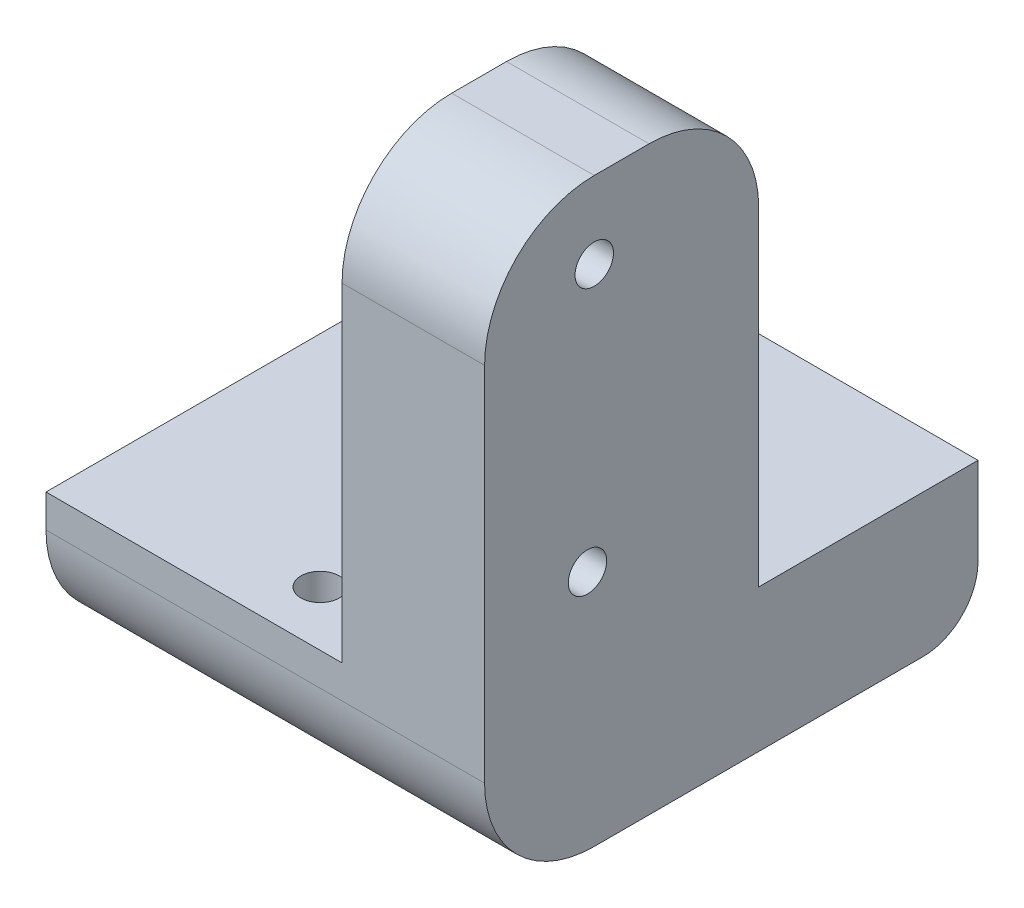
ISO-10303-21;
HEADER;
FILE_DESCRIPTION(('STEP AP214'),'2;1');
FILE_NAME('part.step','',(''),(''),'','','');
FILE_SCHEMA(('AUTOMOTIVE_DESIGN { 1 0 10303 214 1 1 1 1 }'));
ENDSEC;
DATA;
#1=APPLICATION_CONTEXT('core data for automotive mechanical design processes');
#2=APPLICATION_PROTOCOL_DEFINITION('international standard','automotive_design',2000,#1);
#3=PRODUCT_CONTEXT('',#1,'mechanical');
#4=PRODUCT('Part','Part','',(#3));
#5=PRODUCT_RELATED_PRODUCT_CATEGORY('part','',(#4));
#6=PRODUCT_DEFINITION_FORMATION('','',#4);
#7=PRODUCT_DEFINITION_CONTEXT('part definition',#1,'design');
#8=PRODUCT_DEFINITION('design','',#6,#7);
#9=PRODUCT_DEFINITION_SHAPE('','',#8);
#10=(LENGTH_UNIT() NAMED_UNIT(*) SI_UNIT(.MILLI.,.METRE.));
#11=(NAMED_UNIT(*) PLANE_ANGLE_UNIT() SI_UNIT($,.RADIAN.));
#12=(NAMED_UNIT(*) SI_UNIT($,.STERADIAN.) SOLID_ANGLE_UNIT());
#13=UNCERTAINTY_MEASURE_WITH_UNIT(LENGTH_MEASURE(1.E-05),#10,'distance_accuracy_value','');
#14=(GEOMETRIC_REPRESENTATION_CONTEXT(3) GLOBAL_UNCERTAINTY_ASSIGNED_CONTEXT((#13)) GLOBAL_UNIT_ASSIGNED_CONTEXT((#10,
#11,#12)) REPRESENTATION_CONTEXT('',''));
#15=CARTESIAN_POINT('',(0.,0.,0.));
#16=DIRECTION('',(0.,0.,1.));
#17=DIRECTION('',(1.,0.,0.));
#18=AXIS2_PLACEMENT_3D('',#15,#16,#17);
#19=CARTESIAN_POINT('',(-12.,22.,10.6168101370026));
#20=DIRECTION('',(1.,0.,0.));
#21=DIRECTION('',(0.,0.,-1.));
#22=AXIS2_PLACEMENT_3D('',#19,#20,#21);
#23=CYLINDRICAL_SURFACE('',#22,1.75);
#24=CARTESIAN_POINT('',(20.,22.,10.6168101370026));
#25=DIRECTION('',(1.,0.,0.));
#26=DIRECTION('',(0.,0.,-1.));
#27=AXIS2_PLACEMENT_3D('',#24,#25,#26);
#28=CIRCLE('',#27,1.75);
#29=CARTESIAN_POINT('',(20.,22.,8.86681013700256));
#30=VERTEX_POINT('',#29);
#31=EDGE_CURVE('E344',#30,#30,#28,.T.);
#32=ORIENTED_EDGE('',*,*,#31,.T.);
#33=EDGE_LOOP('',(#32));
#34=FACE_BOUND('',#33,.T.);
#35=CARTESIAN_POINT('',(12.,22.,10.6168101370026));
#36=DIRECTION('',(-1.,0.,0.));
#37=DIRECTION('',(0.,0.,1.));
#38=AXIS2_PLACEMENT_3D('',#35,#36,#37);
#39=CIRCLE('',#38,1.75);
#40=CARTESIAN_POINT('',(12.,22.,12.3668101370026));
#41=VERTEX_POINT('',#40);
#42=EDGE_CURVE('E49',#41,#41,#39,.F.);
#43=ORIENTED_EDGE('',*,*,#42,.F.);
#44=EDGE_LOOP('',(#43));
#45=FACE_BOUND('',#44,.T.);
#46=ADVANCED_FACE('F45',(#34,#45),#23,.F.);
#47=CARTESIAN_POINT('',(-12.,46.,10.));
#48=DIRECTION('',(1.,0.,0.));
#49=DIRECTION('',(0.,0.,-1.));
#50=AXIS2_PLACEMENT_3D('',#47,#48,#49);
#51=CYLINDRICAL_SURFACE('',#50,1.75);
#52=CARTESIAN_POINT('',(20.,46.,10.));
#53=DIRECTION('',(1.,0.,0.));
#54=DIRECTION('',(0.,0.,-1.));
#55=AXIS2_PLACEMENT_3D('',#52,#53,#54);
#56=CIRCLE('',#55,1.75);
#57=CARTESIAN_POINT('',(20.,46.,8.25));
#58=VERTEX_POINT('',#57);
#59=EDGE_CURVE('E350',#58,#58,#56,.T.);
#60=ORIENTED_EDGE('',*,*,#59,.T.);
#61=EDGE_LOOP('',(#60));
#62=FACE_BOUND('',#61,.T.);
#63=CARTESIAN_POINT('',(12.,46.,10.));
#64=DIRECTION('',(-1.,0.,0.));
#65=DIRECTION('',(0.,0.,1.));
#66=AXIS2_PLACEMENT_3D('',#63,#64,#65);
#67=CIRCLE('',#66,1.75);
#68=CARTESIAN_POINT('',(12.,46.,11.75));
#69=VERTEX_POINT('',#68);
#70=EDGE_CURVE('E282',#69,#69,#67,.F.);
#71=ORIENTED_EDGE('',*,*,#70,.F.);
#72=EDGE_LOOP('',(#71));
#73=FACE_BOUND('',#72,.T.);
#74=ADVANCED_FACE('F434',(#62,#73),#51,.F.);
#75=CARTESIAN_POINT('',(0.,0.,0.));
#76=DIRECTION('',(0.,1.,0.));
#77=DIRECTION('',(0.,0.,1.));
#78=AXIS2_PLACEMENT_3D('',#75,#76,#77);
#79=PLANE('',#78);
#80=DIRECTION('',(0.,0.,1.));
#81=VECTOR('',#80,1.);
#82=CARTESIAN_POINT('',(-20.,0.,-25.));
#83=LINE('',#82,#81);
#84=CARTESIAN_POINT('',(-20.,0.,-20.));
#85=VERTEX_POINT('',#84);
#86=CARTESIAN_POINT('',(-20.,0.,10.));
#87=VERTEX_POINT('',#86);
#88=EDGE_CURVE('E193',#85,#87,#83,.T.);
#89=ORIENTED_EDGE('',*,*,#88,.F.);
#90=DIRECTION('',(-1.,0.,0.));
#91=VECTOR('',#90,1.);
#92=CARTESIAN_POINT('',(0.,0.,-20.));
#93=LINE('',#92,#91);
#94=CARTESIAN_POINT('',(-13.,0.,-20.));
#95=VERTEX_POINT('',#94);
#96=EDGE_CURVE('E270',#85,#95,#93,.F.);
#97=ORIENTED_EDGE('',*,*,#96,.T.);
#98=DIRECTION('',(0.,0.,-1.));
#99=VECTOR('',#98,1.);
#100=CARTESIAN_POINT('',(-13.,0.,25.));
#101=LINE('',#100,#99);
#102=CARTESIAN_POINT('',(-13.,0.,10.));
#103=VERTEX_POINT('',#102);
#104=EDGE_CURVE('E332',#103,#95,#101,.T.);
#105=ORIENTED_EDGE('',*,*,#104,.F.);
#106=DIRECTION('',(1.,0.,0.));
#107=VECTOR('',#106,1.);
#108=CARTESIAN_POINT('',(0.,0.,10.));
#109=LINE('',#108,#107);
#110=EDGE_CURVE('E257',#103,#87,#109,.F.);
#111=ORIENTED_EDGE('',*,*,#110,.T.);
#112=EDGE_LOOP('',(#89,#97,#105,#111));
#113=FACE_BOUND('',#112,.T.);
#114=ADVANCED_FACE('F393',(#113),#79,.F.);
#115=CARTESIAN_POINT('',(-20.,13.,-25.));
#116=DIRECTION('',(1.,0.,0.));
#117=DIRECTION('',(0.,0.,-1.));
#118=AXIS2_PLACEMENT_3D('',#115,#116,#117);
#119=PLANE('',#118);
#120=DIRECTION('',(0.,-1.,0.));
#121=VECTOR('',#120,1.);
#122=CARTESIAN_POINT('',(-20.,13.,-25.));
#123=LINE('',#122,#121);
#124=CARTESIAN_POINT('',(-20.,13.,-25.));
#125=VERTEX_POINT('',#124);
#126=CARTESIAN_POINT('',(-20.,5.,-25.));
#127=VERTEX_POINT('',#126);
#128=EDGE_CURVE('E201',#125,#127,#123,.T.);
#129=ORIENTED_EDGE('',*,*,#128,.T.);
#130=CARTESIAN_POINT('',(-20.,5.,-20.));
#131=DIRECTION('',(1.,0.,0.));
#132=DIRECTION('',(0.,0.,-1.));
#133=AXIS2_PLACEMENT_3D('',#130,#131,#132);
#134=CIRCLE('',#133,5.);
#135=EDGE_CURVE('E267',#127,#85,#134,.F.);
#136=ORIENTED_EDGE('',*,*,#135,.T.);
#137=ORIENTED_EDGE('',*,*,#88,.T.);
#138=CARTESIAN_POINT('',(-20.,10.,10.));
#139=DIRECTION('',(1.,0.,0.));
#140=DIRECTION('',(0.,0.,-1.));
#141=AXIS2_PLACEMENT_3D('',#138,#139,#140);
#142=CIRCLE('',#141,10.);
#143=CARTESIAN_POINT('',(-20.,10.,20.));
#144=VERTEX_POINT('',#143);
#145=EDGE_CURVE('E177',#87,#144,#142,.F.);
#146=ORIENTED_EDGE('',*,*,#145,.T.);
#147=DIRECTION('',(0.,-1.,0.));
#148=VECTOR('',#147,1.);
#149=CARTESIAN_POINT('',(-20.,53.,20.));
#150=LINE('',#149,#148);
#151=CARTESIAN_POINT('',(-20.,13.,20.));
#152=VERTEX_POINT('',#151);
#153=EDGE_CURVE('E159',#152,#144,#150,.T.);
#154=ORIENTED_EDGE('',*,*,#153,.F.);
#155=DIRECTION('',(0.,0.,1.));
#156=VECTOR('',#155,1.);
#157=CARTESIAN_POINT('',(-20.,13.,-25.));
#158=LINE('',#157,#156);
#159=EDGE_CURVE('E175',#125,#152,#158,.T.);
#160=ORIENTED_EDGE('',*,*,#159,.F.);
#161=EDGE_LOOP('',(#129,#136,#137,#146,#154,#160));
#162=FACE_BOUND('',#161,.T.);
#163=ADVANCED_FACE('F174',(#162),#119,.F.);
#164=CARTESIAN_POINT('',(20.,13.,-25.));
#165=DIRECTION('',(-1.,0.,0.));
#166=DIRECTION('',(0.,0.,1.));
#167=AXIS2_PLACEMENT_3D('',#164,#165,#166);
#168=PLANE('',#167);
#169=ORIENTED_EDGE('',*,*,#59,.F.);
#170=EDGE_LOOP('',(#169));
#171=FACE_BOUND('',#170,.T.);
#172=ORIENTED_EDGE('',*,*,#31,.F.);
#173=EDGE_LOOP('',(#172));
#174=FACE_BOUND('',#173,.T.);
#175=DIRECTION('',(0.,0.,-1.));
#176=VECTOR('',#175,1.);
#177=CARTESIAN_POINT('',(20.,0.,-25.));
#178=LINE('',#177,#176);
#179=CARTESIAN_POINT('',(20.,0.,10.));
#180=VERTEX_POINT('',#179);
#181=CARTESIAN_POINT('',(20.,0.,-20.));
#182=VERTEX_POINT('',#181);
#183=EDGE_CURVE('E188',#180,#182,#178,.T.);
#184=ORIENTED_EDGE('',*,*,#183,.T.);
#185=CARTESIAN_POINT('',(20.,5.,-20.));
#186=DIRECTION('',(-1.,0.,0.));
#187=DIRECTION('',(0.,0.,1.));
#188=AXIS2_PLACEMENT_3D('',#185,#186,#187);
#189=CIRCLE('',#188,5.);
#190=CARTESIAN_POINT('',(20.,5.,-25.));
#191=VERTEX_POINT('',#190);
#192=EDGE_CURVE('E11',#182,#191,#189,.F.);
#193=ORIENTED_EDGE('',*,*,#192,.T.);
#194=DIRECTION('',(0.,-1.,0.));
#195=VECTOR('',#194,1.);
#196=CARTESIAN_POINT('',(20.,13.,-25.));
#197=LINE('',#196,#195);
#198=CARTESIAN_POINT('',(20.,13.,-25.));
#199=VERTEX_POINT('',#198);
#200=EDGE_CURVE('E206',#199,#191,#197,.T.);
#201=ORIENTED_EDGE('',*,*,#200,.F.);
#202=DIRECTION('',(0.,0.,-1.));
#203=VECTOR('',#202,1.);
#204=CARTESIAN_POINT('',(20.,13.,-25.));
#205=LINE('',#204,#203);
#206=CARTESIAN_POINT('',(20.,13.,-5.));
#207=VERTEX_POINT('',#206);
#208=EDGE_CURVE('E187',#207,#199,#205,.T.);
#209=ORIENTED_EDGE('',*,*,#208,.F.);
#210=DIRECTION('',(0.,-1.,0.));
#211=VECTOR('',#210,1.);
#212=CARTESIAN_POINT('',(20.,53.,-5.));
#213=LINE('',#212,#211);
#214=CARTESIAN_POINT('',(20.,43.,-5.));
#215=VERTEX_POINT('',#214);
#216=EDGE_CURVE('E196',#215,#207,#213,.T.);
#217=ORIENTED_EDGE('',*,*,#216,.F.);
#218=CARTESIAN_POINT('',(20.,43.,5.));
#219=DIRECTION('',(-1.,0.,0.));
#220=DIRECTION('',(0.,0.,1.));
#221=AXIS2_PLACEMENT_3D('',#218,#219,#220);
#222=CIRCLE('',#221,10.);
#223=CARTESIAN_POINT('',(20.,53.,5.));
#224=VERTEX_POINT('',#223);
#225=EDGE_CURVE('E234',#215,#224,#222,.F.);
#226=ORIENTED_EDGE('',*,*,#225,.T.);
#227=DIRECTION('',(0.,0.,-1.));
#228=VECTOR('',#227,1.);
#229=CARTESIAN_POINT('',(20.,53.,25.));
#230=LINE('',#229,#228);
#231=CARTESIAN_POINT('',(20.,53.,10.));
#232=VERTEX_POINT('',#231);
#233=EDGE_CURVE('E358',#232,#224,#230,.T.);
#234=ORIENTED_EDGE('',*,*,#233,.F.);
#235=CARTESIAN_POINT('',(20.,43.,10.));
#236=DIRECTION('',(-1.,0.,0.));
#237=DIRECTION('',(0.,0.,1.));
#238=AXIS2_PLACEMENT_3D('',#235,#236,#237);
#239=CIRCLE('',#238,10.);
#240=CARTESIAN_POINT('',(20.,43.,20.));
#241=VERTEX_POINT('',#240);
#242=EDGE_CURVE('E220',#232,#241,#239,.F.);
#243=ORIENTED_EDGE('',*,*,#242,.T.);
#244=DIRECTION('',(0.,1.,0.));
#245=VECTOR('',#244,1.);
#246=CARTESIAN_POINT('',(20.,53.,20.));
#247=LINE('',#246,#245);
#248=CARTESIAN_POINT('',(20.,10.,20.));
#249=VERTEX_POINT('',#248);
#250=EDGE_CURVE('E179',#249,#241,#247,.T.);
#251=ORIENTED_EDGE('',*,*,#250,.F.);
#252=CARTESIAN_POINT('',(20.,10.,10.));
#253=DIRECTION('',(-1.,0.,0.));
#254=DIRECTION('',(0.,0.,1.));
#255=AXIS2_PLACEMENT_3D('',#252,#253,#254);
#256=CIRCLE('',#255,10.);
#257=EDGE_CURVE('E240',#249,#180,#256,.F.);
#258=ORIENTED_EDGE('',*,*,#257,.T.);
#259=EDGE_LOOP('',(#184,#193,#201,#209,#217,#226,#234,#243,#251,#258));
#260=FACE_BOUND('',#259,.T.);
#261=ADVANCED_FACE('F384',(#171,#174,#260),#168,.F.);
#262=CARTESIAN_POINT('',(-20.,13.,-25.));
#263=DIRECTION('',(0.,0.,1.));
#264=DIRECTION('',(1.,0.,0.));
#265=AXIS2_PLACEMENT_3D('',#262,#263,#264);
#266=PLANE('',#265);
#267=ORIENTED_EDGE('',*,*,#200,.T.);
#268=DIRECTION('',(-1.,0.,0.));
#269=VECTOR('',#268,1.);
#270=CARTESIAN_POINT('',(-20.,5.,-25.));
#271=LINE('',#270,#269);
#272=EDGE_CURVE('E263',#191,#127,#271,.T.);
#273=ORIENTED_EDGE('',*,*,#272,.T.);
#274=ORIENTED_EDGE('',*,*,#128,.F.);
#275=DIRECTION('',(-1.,0.,0.));
#276=VECTOR('',#275,1.);
#277=CARTESIAN_POINT('',(-20.,13.,-25.));
#278=LINE('',#277,#276);
#279=EDGE_CURVE('E184',#199,#125,#278,.T.);
#280=ORIENTED_EDGE('',*,*,#279,.F.);
#281=EDGE_LOOP('',(#267,#273,#274,#280));
#282=FACE_BOUND('',#281,.T.);
#283=ADVANCED_FACE('F388',(#282),#266,.F.);
#284=CARTESIAN_POINT('',(0.,13.,0.));
#285=DIRECTION('',(0.,1.,0.));
#286=DIRECTION('',(0.,0.,1.));
#287=AXIS2_PLACEMENT_3D('',#284,#285,#286);
#288=PLANE('',#287);
#289=DIRECTION('',(-1.,0.,0.));
#290=VECTOR('',#289,1.);
#291=CARTESIAN_POINT('',(0.,13.,20.));
#292=LINE('',#291,#290);
#293=CARTESIAN_POINT('',(7.,13.,20.));
#294=VERTEX_POINT('',#293);
#295=EDGE_CURVE('E155',#294,#152,#292,.T.);
#296=ORIENTED_EDGE('',*,*,#295,.F.);
#297=DIRECTION('',(0.,0.,1.));
#298=VECTOR('',#297,1.);
#299=CARTESIAN_POINT('',(7.,13.,25.));
#300=LINE('',#299,#298);
#301=CARTESIAN_POINT('',(7.,13.,-4.99999999999999));
#302=VERTEX_POINT('',#301);
#303=EDGE_CURVE('E363',#302,#294,#300,.T.);
#304=ORIENTED_EDGE('',*,*,#303,.F.);
#305=DIRECTION('',(-1.,0.,0.));
#306=VECTOR('',#305,1.);
#307=CARTESIAN_POINT('',(20.,13.,-5.));
#308=LINE('',#307,#306);
#309=EDGE_CURVE('E354',#207,#302,#308,.T.);
#310=ORIENTED_EDGE('',*,*,#309,.F.);
#311=ORIENTED_EDGE('',*,*,#208,.T.);
#312=ORIENTED_EDGE('',*,*,#279,.T.);
#313=ORIENTED_EDGE('',*,*,#159,.T.);
#314=EDGE_LOOP('',(#296,#304,#310,#311,#312,#313));
#315=FACE_BOUND('',#314,.T.);
#316=CARTESIAN_POINT('',(0.,13.,-15.));
#317=DIRECTION('',(0.,-1.,0.));
#318=DIRECTION('',(0.,0.,-1.));
#319=AXIS2_PLACEMENT_3D('',#316,#317,#318);
#320=CIRCLE('',#319,1.75);
#321=CARTESIAN_POINT('',(0.,13.,-16.75));
#322=VERTEX_POINT('',#321);
#323=EDGE_CURVE('E169',#322,#322,#320,.T.);
#324=ORIENTED_EDGE('',*,*,#323,.T.);
#325=EDGE_LOOP('',(#324));
#326=FACE_BOUND('',#325,.T.);
#327=CARTESIAN_POINT('',(0.,13.,15.));
#328=DIRECTION('',(0.,-1.,0.));
#329=DIRECTION('',(0.,0.,-1.));
#330=AXIS2_PLACEMENT_3D('',#327,#328,#329);
#331=CIRCLE('',#330,1.75);
#332=CARTESIAN_POINT('',(0.,13.,13.25));
#333=VERTEX_POINT('',#332);
#334=EDGE_CURVE('E317',#333,#333,#331,.T.);
#335=ORIENTED_EDGE('',*,*,#334,.T.);
#336=EDGE_LOOP('',(#335));
#337=FACE_BOUND('',#336,.T.);
#338=CARTESIAN_POINT('',(0.,13.,0.));
#339=DIRECTION('',(0.,-1.,0.));
#340=DIRECTION('',(0.,0.,-1.));
#341=AXIS2_PLACEMENT_3D('',#338,#339,#340);
#342=CIRCLE('',#341,1.75);
#343=CARTESIAN_POINT('',(0.,13.,-1.75));
#344=VERTEX_POINT('',#343);
#345=EDGE_CURVE('E328',#344,#344,#342,.T.);
#346=ORIENTED_EDGE('',*,*,#345,.T.);
#347=EDGE_LOOP('',(#346));
#348=FACE_BOUND('',#347,.T.);
#349=ADVANCED_FACE('F181',(#315,#326,#337,#348),#288,.T.);
#350=DIRECTION('',(0.,0.,1.));
#351=VECTOR('',#350,1.);
#352=CARTESIAN_POINT('',(13.,0.,25.));
#353=LINE('',#352,#351);
#354=CARTESIAN_POINT('',(13.,0.,-20.));
#355=VERTEX_POINT('',#354);
#356=CARTESIAN_POINT('',(13.,0.,10.));
#357=VERTEX_POINT('',#356);
#358=EDGE_CURVE('E341',#355,#357,#353,.T.);
#359=ORIENTED_EDGE('',*,*,#358,.F.);
#360=DIRECTION('',(-1.,0.,0.));
#361=VECTOR('',#360,1.);
#362=CARTESIAN_POINT('',(16.5,0.,-20.));
#363=LINE('',#362,#361);
#364=EDGE_CURVE('E55',#355,#182,#363,.F.);
#365=ORIENTED_EDGE('',*,*,#364,.T.);
#366=ORIENTED_EDGE('',*,*,#183,.F.);
#367=DIRECTION('',(1.,0.,0.));
#368=VECTOR('',#367,1.);
#369=CARTESIAN_POINT('',(16.5,0.,10.));
#370=LINE('',#369,#368);
#371=EDGE_CURVE('E243',#180,#357,#370,.F.);
#372=ORIENTED_EDGE('',*,*,#371,.T.);
#373=EDGE_LOOP('',(#359,#365,#366,#372));
#374=FACE_BOUND('',#373,.T.);
#375=ADVANCED_FACE('F452',(#374),#79,.F.);
#376=CARTESIAN_POINT('',(20.,53.,-5.));
#377=DIRECTION('',(0.,0.,1.));
#378=DIRECTION('',(1.,0.,0.));
#379=AXIS2_PLACEMENT_3D('',#376,#377,#378);
#380=PLANE('',#379);
#381=DIRECTION('',(0.,-1.,0.));
#382=VECTOR('',#381,1.);
#383=CARTESIAN_POINT('',(7.,53.,-4.99999999999999));
#384=LINE('',#383,#382);
#385=CARTESIAN_POINT('',(7.,43.,-4.99999999999999));
#386=VERTEX_POINT('',#385);
#387=EDGE_CURVE('E366',#386,#302,#384,.T.);
#388=ORIENTED_EDGE('',*,*,#387,.F.);
#389=DIRECTION('',(-1.,0.,0.));
#390=VECTOR('',#389,1.);
#391=CARTESIAN_POINT('',(20.,43.,-5.));
#392=LINE('',#391,#390);
#393=EDGE_CURVE('E231',#386,#215,#392,.F.);
#394=ORIENTED_EDGE('',*,*,#393,.T.);
#395=ORIENTED_EDGE('',*,*,#216,.T.);
#396=ORIENTED_EDGE('',*,*,#309,.T.);
#397=EDGE_LOOP('',(#388,#394,#395,#396));
#398=FACE_BOUND('',#397,.T.);
#399=ADVANCED_FACE('F378',(#398),#380,.F.);
#400=CARTESIAN_POINT('',(7.,53.,25.));
#401=DIRECTION('',(1.,0.,0.));
#402=DIRECTION('',(0.,0.,-1.));
#403=AXIS2_PLACEMENT_3D('',#400,#401,#402);
#404=PLANE('',#403);
#405=CARTESIAN_POINT('',(7.,22.,10.6168101370026));
#406=DIRECTION('',(-1.,0.,0.));
#407=DIRECTION('',(0.,0.,1.));
#408=AXIS2_PLACEMENT_3D('',#405,#406,#407);
#409=CIRCLE('',#408,3.5);
#410=CARTESIAN_POINT('',(7.,22.,14.1168101370026));
#411=VERTEX_POINT('',#410);
#412=EDGE_CURVE('E292',#411,#411,#409,.T.);
#413=ORIENTED_EDGE('',*,*,#412,.F.);
#414=EDGE_LOOP('',(#413));
#415=FACE_BOUND('',#414,.T.);
#416=CARTESIAN_POINT('',(7.,46.,10.));
#417=DIRECTION('',(-1.,0.,0.));
#418=DIRECTION('',(0.,0.,1.));
#419=AXIS2_PLACEMENT_3D('',#416,#417,#418);
#420=CIRCLE('',#419,3.5);
#421=CARTESIAN_POINT('',(7.,46.,13.5));
#422=VERTEX_POINT('',#421);
#423=EDGE_CURVE('E298',#422,#422,#420,.T.);
#424=ORIENTED_EDGE('',*,*,#423,.F.);
#425=EDGE_LOOP('',(#424));
#426=FACE_BOUND('',#425,.T.);
#427=DIRECTION('',(0.,0.,1.));
#428=VECTOR('',#427,1.);
#429=CARTESIAN_POINT('',(7.,53.,25.));
#430=LINE('',#429,#428);
#431=CARTESIAN_POINT('',(7.,53.,5.00000000000001));
#432=VERTEX_POINT('',#431);
#433=CARTESIAN_POINT('',(7.,53.,10.));
#434=VERTEX_POINT('',#433);
#435=EDGE_CURVE('E362',#432,#434,#430,.T.);
#436=ORIENTED_EDGE('',*,*,#435,.F.);
#437=CARTESIAN_POINT('',(7.,43.,5.00000000000001));
#438=DIRECTION('',(1.,0.,0.));
#439=DIRECTION('',(0.,0.,-1.));
#440=AXIS2_PLACEMENT_3D('',#437,#438,#439);
#441=CIRCLE('',#440,10.);
#442=EDGE_CURVE('E228',#432,#386,#441,.F.);
#443=ORIENTED_EDGE('',*,*,#442,.T.);
#444=ORIENTED_EDGE('',*,*,#387,.T.);
#445=ORIENTED_EDGE('',*,*,#303,.T.);
#446=DIRECTION('',(0.,1.,0.));
#447=VECTOR('',#446,1.);
#448=CARTESIAN_POINT('',(7.,53.,20.));
#449=LINE('',#448,#447);
#450=CARTESIAN_POINT('',(7.,43.,20.));
#451=VERTEX_POINT('',#450);
#452=EDGE_CURVE('E163',#294,#451,#449,.T.);
#453=ORIENTED_EDGE('',*,*,#452,.T.);
#454=CARTESIAN_POINT('',(7.,43.,10.));
#455=DIRECTION('',(1.,0.,0.));
#456=DIRECTION('',(0.,0.,-1.));
#457=AXIS2_PLACEMENT_3D('',#454,#455,#456);
#458=CIRCLE('',#457,10.);
#459=EDGE_CURVE('E213',#451,#434,#458,.F.);
#460=ORIENTED_EDGE('',*,*,#459,.T.);
#461=EDGE_LOOP('',(#436,#443,#444,#445,#453,#460));
#462=FACE_BOUND('',#461,.T.);
#463=ADVANCED_FACE('F418',(#415,#426,#462),#404,.F.);
#464=CARTESIAN_POINT('',(0.,53.,0.));
#465=DIRECTION('',(0.,1.,0.));
#466=DIRECTION('',(0.,0.,1.));
#467=AXIS2_PLACEMENT_3D('',#464,#465,#466);
#468=PLANE('',#467);
#469=ORIENTED_EDGE('',*,*,#233,.T.);
#470=DIRECTION('',(-1.,0.,0.));
#471=VECTOR('',#470,1.);
#472=CARTESIAN_POINT('',(7.00000000000001,53.,5.00000000000001));
#473=LINE('',#472,#471);
#474=EDGE_CURVE('E224',#224,#432,#473,.T.);
#475=ORIENTED_EDGE('',*,*,#474,.T.);
#476=ORIENTED_EDGE('',*,*,#435,.T.);
#477=DIRECTION('',(-1.,0.,0.));
#478=VECTOR('',#477,1.);
#479=CARTESIAN_POINT('',(20.,53.,10.));
#480=LINE('',#479,#478);
#481=EDGE_CURVE('E217',#434,#232,#480,.F.);
#482=ORIENTED_EDGE('',*,*,#481,.T.);
#483=EDGE_LOOP('',(#469,#475,#476,#482));
#484=FACE_BOUND('',#483,.T.);
#485=ADVANCED_FACE('F420',(#484),#468,.T.);
#486=CARTESIAN_POINT('',(-13.,3.,25.));
#487=DIRECTION('',(-1.,0.,0.));
#488=DIRECTION('',(0.,0.,1.));
#489=AXIS2_PLACEMENT_3D('',#486,#487,#488);
#490=PLANE('',#489);
#491=ORIENTED_EDGE('',*,*,#104,.T.);
#492=CARTESIAN_POINT('',(-13.,5.,-20.));
#493=DIRECTION('',(-1.,0.,0.));
#494=DIRECTION('',(0.,0.,1.));
#495=AXIS2_PLACEMENT_3D('',#492,#493,#494);
#496=CIRCLE('',#495,5.);
#497=CARTESIAN_POINT('',(-13.,3.,-24.5825756949558));
#498=VERTEX_POINT('',#497);
#499=EDGE_CURVE('E273',#95,#498,#496,.F.);
#500=ORIENTED_EDGE('',*,*,#499,.T.);
#501=DIRECTION('',(0.,0.,-1.));
#502=VECTOR('',#501,1.);
#503=CARTESIAN_POINT('',(-13.,3.,25.));
#504=LINE('',#503,#502);
#505=CARTESIAN_POINT('',(-13.,3.,17.1414284285429));
#506=VERTEX_POINT('',#505);
#507=EDGE_CURVE('E336',#506,#498,#504,.T.);
#508=ORIENTED_EDGE('',*,*,#507,.F.);
#509=CARTESIAN_POINT('',(-13.,10.,10.));
#510=DIRECTION('',(-1.,0.,0.));
#511=DIRECTION('',(0.,0.,1.));
#512=AXIS2_PLACEMENT_3D('',#509,#510,#511);
#513=CIRCLE('',#512,10.);
#514=EDGE_CURVE('E254',#506,#103,#513,.F.);
#515=ORIENTED_EDGE('',*,*,#514,.T.);
#516=EDGE_LOOP('',(#491,#500,#508,#515));
#517=FACE_BOUND('',#516,.T.);
#518=ADVANCED_FACE('F400',(#517),#490,.F.);
#519=CARTESIAN_POINT('',(13.,3.,25.));
#520=DIRECTION('',(1.,0.,0.));
#521=DIRECTION('',(0.,0.,-1.));
#522=AXIS2_PLACEMENT_3D('',#519,#520,#521);
#523=PLANE('',#522);
#524=DIRECTION('',(0.,0.,1.));
#525=VECTOR('',#524,1.);
#526=CARTESIAN_POINT('',(13.,3.,25.));
#527=LINE('',#526,#525);
#528=CARTESIAN_POINT('',(13.,3.,-24.5825756949558));
#529=VERTEX_POINT('',#528);
#530=CARTESIAN_POINT('',(13.,3.,17.1414284285429));
#531=VERTEX_POINT('',#530);
#532=EDGE_CURVE('E340',#529,#531,#527,.T.);
#533=ORIENTED_EDGE('',*,*,#532,.F.);
#534=CARTESIAN_POINT('',(13.,5.,-20.));
#535=DIRECTION('',(1.,0.,0.));
#536=DIRECTION('',(0.,0.,-1.));
#537=AXIS2_PLACEMENT_3D('',#534,#535,#536);
#538=CIRCLE('',#537,5.);
#539=EDGE_CURVE('E70',#529,#355,#538,.F.);
#540=ORIENTED_EDGE('',*,*,#539,.T.);
#541=ORIENTED_EDGE('',*,*,#358,.T.);
#542=CARTESIAN_POINT('',(13.,10.,10.));
#543=DIRECTION('',(1.,0.,0.));
#544=DIRECTION('',(0.,0.,-1.));
#545=AXIS2_PLACEMENT_3D('',#542,#543,#544);
#546=CIRCLE('',#545,10.);
#547=EDGE_CURVE('E247',#357,#531,#546,.F.);
#548=ORIENTED_EDGE('',*,*,#547,.T.);
#549=EDGE_LOOP('',(#533,#540,#541,#548));
#550=FACE_BOUND('',#549,.T.);
#551=ADVANCED_FACE('F579',(#550),#523,.F.);
#552=CARTESIAN_POINT('',(0.,3.,0.));
#553=DIRECTION('',(0.,-1.,0.));
#554=DIRECTION('',(0.,0.,-1.));
#555=AXIS2_PLACEMENT_3D('',#552,#553,#554);
#556=PLANE('',#555);
#557=ORIENTED_EDGE('',*,*,#507,.T.);
#558=DIRECTION('',(-1.,0.,0.));
#559=VECTOR('',#558,1.);
#560=CARTESIAN_POINT('',(-13.,3.,-24.5825756949558));
#561=LINE('',#560,#559);
#562=EDGE_CURVE('E276',#498,#529,#561,.F.);
#563=ORIENTED_EDGE('',*,*,#562,.T.);
#564=ORIENTED_EDGE('',*,*,#532,.T.);
#565=DIRECTION('',(1.,0.,0.));
#566=VECTOR('',#565,1.);
#567=CARTESIAN_POINT('',(13.,3.,17.1414284285429));
#568=LINE('',#567,#566);
#569=EDGE_CURVE('E251',#531,#506,#568,.F.);
#570=ORIENTED_EDGE('',*,*,#569,.T.);
#571=EDGE_LOOP('',(#557,#563,#564,#570));
#572=FACE_BOUND('',#571,.T.);
#573=CARTESIAN_POINT('',(0.,3.,-15.));
#574=DIRECTION('',(0.,-1.,0.));
#575=DIRECTION('',(0.,0.,-1.));
#576=AXIS2_PLACEMENT_3D('',#573,#574,#575);
#577=CIRCLE('',#576,1.75);
#578=CARTESIAN_POINT('',(0.,3.,-16.75));
#579=VERTEX_POINT('',#578);
#580=EDGE_CURVE('E321',#579,#579,#577,.T.);
#581=ORIENTED_EDGE('',*,*,#580,.F.);
#582=EDGE_LOOP('',(#581));
#583=FACE_BOUND('',#582,.T.);
#584=CARTESIAN_POINT('',(0.,3.,15.));
#585=DIRECTION('',(0.,-1.,0.));
#586=DIRECTION('',(0.,0.,-1.));
#587=AXIS2_PLACEMENT_3D('',#584,#585,#586);
#588=CIRCLE('',#587,1.75);
#589=CARTESIAN_POINT('',(0.,3.,13.25));
#590=VERTEX_POINT('',#589);
#591=EDGE_CURVE('E312',#590,#590,#588,.T.);
#592=ORIENTED_EDGE('',*,*,#591,.F.);
#593=EDGE_LOOP('',(#592));
#594=FACE_BOUND('',#593,.T.);
#595=CARTESIAN_POINT('',(0.,3.,0.));
#596=DIRECTION('',(0.,-1.,0.));
#597=DIRECTION('',(0.,0.,-1.));
#598=AXIS2_PLACEMENT_3D('',#595,#596,#597);
#599=CIRCLE('',#598,1.75);
#600=CARTESIAN_POINT('',(0.,3.,-1.75));
#601=VERTEX_POINT('',#600);
#602=EDGE_CURVE('E316',#601,#601,#599,.T.);
#603=ORIENTED_EDGE('',*,*,#602,.F.);
#604=EDGE_LOOP('',(#603));
#605=FACE_BOUND('',#604,.T.);
#606=ADVANCED_FACE('F403',(#572,#583,#594,#605),#556,.T.);
#607=CARTESIAN_POINT('',(0.,13.,0.));
#608=DIRECTION('',(0.,-1.,0.));
#609=DIRECTION('',(0.,0.,-1.));
#610=AXIS2_PLACEMENT_3D('',#607,#608,#609);
#611=CYLINDRICAL_SURFACE('',#610,1.75);
#612=ORIENTED_EDGE('',*,*,#345,.F.);
#613=EDGE_LOOP('',(#612));
#614=FACE_BOUND('',#613,.T.);
#615=ORIENTED_EDGE('',*,*,#602,.T.);
#616=EDGE_LOOP('',(#615));
#617=FACE_BOUND('',#616,.T.);
#618=ADVANCED_FACE('F595',(#614,#617),#611,.F.);
#619=CARTESIAN_POINT('',(0.,13.,15.));
#620=DIRECTION('',(0.,-1.,0.));
#621=DIRECTION('',(0.,0.,-1.));
#622=AXIS2_PLACEMENT_3D('',#619,#620,#621);
#623=CYLINDRICAL_SURFACE('',#622,1.75);
#624=ORIENTED_EDGE('',*,*,#334,.F.);
#625=EDGE_LOOP('',(#624));
#626=FACE_BOUND('',#625,.T.);
#627=ORIENTED_EDGE('',*,*,#591,.T.);
#628=EDGE_LOOP('',(#627));
#629=FACE_BOUND('',#628,.T.);
#630=ADVANCED_FACE('F603',(#626,#629),#623,.F.);
#631=CARTESIAN_POINT('',(0.,13.,-15.));
#632=DIRECTION('',(0.,-1.,0.));
#633=DIRECTION('',(0.,0.,-1.));
#634=AXIS2_PLACEMENT_3D('',#631,#632,#633);
#635=CYLINDRICAL_SURFACE('',#634,1.75);
#636=ORIENTED_EDGE('',*,*,#323,.F.);
#637=EDGE_LOOP('',(#636));
#638=FACE_BOUND('',#637,.T.);
#639=ORIENTED_EDGE('',*,*,#580,.T.);
#640=EDGE_LOOP('',(#639));
#641=FACE_BOUND('',#640,.T.);
#642=ADVANCED_FACE('F480',(#638,#641),#635,.F.);
#643=CARTESIAN_POINT('',(0.,0.,20.));
#644=DIRECTION('',(0.,0.,-1.));
#645=DIRECTION('',(-1.,0.,0.));
#646=AXIS2_PLACEMENT_3D('',#643,#644,#645);
#647=PLANE('',#646);
#648=ORIENTED_EDGE('',*,*,#153,.T.);
#649=DIRECTION('',(1.,0.,0.));
#650=VECTOR('',#649,1.);
#651=CARTESIAN_POINT('',(0.,10.,20.));
#652=LINE('',#651,#650);
#653=EDGE_CURVE('E237',#144,#249,#652,.T.);
#654=ORIENTED_EDGE('',*,*,#653,.T.);
#655=ORIENTED_EDGE('',*,*,#250,.T.);
#656=DIRECTION('',(-1.,0.,0.));
#657=VECTOR('',#656,1.);
#658=CARTESIAN_POINT('',(7.00000000000001,43.,20.));
#659=LINE('',#658,#657);
#660=EDGE_CURVE('E210',#241,#451,#659,.T.);
#661=ORIENTED_EDGE('',*,*,#660,.T.);
#662=ORIENTED_EDGE('',*,*,#452,.F.);
#663=ORIENTED_EDGE('',*,*,#295,.T.);
#664=EDGE_LOOP('',(#648,#654,#655,#661,#662,#663));
#665=FACE_BOUND('',#664,.T.);
#666=ADVANCED_FACE('F157',(#665),#647,.F.);
#667=CARTESIAN_POINT('',(0.,43.,10.));
#668=DIRECTION('',(1.,0.,0.));
#669=DIRECTION('',(0.,0.,-1.));
#670=AXIS2_PLACEMENT_3D('',#667,#668,#669);
#671=CYLINDRICAL_SURFACE('',#670,10.);
#672=ORIENTED_EDGE('',*,*,#242,.F.);
#673=ORIENTED_EDGE('',*,*,#481,.F.);
#674=ORIENTED_EDGE('',*,*,#459,.F.);
#675=ORIENTED_EDGE('',*,*,#660,.F.);
#676=EDGE_LOOP('',(#672,#673,#674,#675));
#677=FACE_BOUND('',#676,.T.);
#678=ADVANCED_FACE('F416',(#677),#671,.T.);
#679=CARTESIAN_POINT('',(0.,43.,5.00000000000001));
#680=DIRECTION('',(1.,0.,0.));
#681=DIRECTION('',(0.,0.,-1.));
#682=AXIS2_PLACEMENT_3D('',#679,#680,#681);
#683=CYLINDRICAL_SURFACE('',#682,10.);
#684=ORIENTED_EDGE('',*,*,#225,.F.);
#685=ORIENTED_EDGE('',*,*,#393,.F.);
#686=ORIENTED_EDGE('',*,*,#442,.F.);
#687=ORIENTED_EDGE('',*,*,#474,.F.);
#688=EDGE_LOOP('',(#684,#685,#686,#687));
#689=FACE_BOUND('',#688,.T.);
#690=ADVANCED_FACE('F423',(#689),#683,.T.);
#691=CARTESIAN_POINT('',(0.,10.,10.));
#692=DIRECTION('',(1.,0.,0.));
#693=DIRECTION('',(0.,0.,-1.));
#694=AXIS2_PLACEMENT_3D('',#691,#692,#693);
#695=CYLINDRICAL_SURFACE('',#694,10.);
#696=ORIENTED_EDGE('',*,*,#145,.F.);
#697=ORIENTED_EDGE('',*,*,#110,.F.);
#698=ORIENTED_EDGE('',*,*,#514,.F.);
#699=ORIENTED_EDGE('',*,*,#569,.F.);
#700=ORIENTED_EDGE('',*,*,#547,.F.);
#701=ORIENTED_EDGE('',*,*,#371,.F.);
#702=ORIENTED_EDGE('',*,*,#257,.F.);
#703=ORIENTED_EDGE('',*,*,#653,.F.);
#704=EDGE_LOOP('',(#696,#697,#698,#699,#700,#701,#702,#703));
#705=FACE_BOUND('',#704,.T.);
#706=ADVANCED_FACE('F408',(#705),#695,.T.);
#707=CARTESIAN_POINT('',(-20.,5.,-20.));
#708=DIRECTION('',(-1.,0.,0.));
#709=DIRECTION('',(0.,0.,1.));
#710=AXIS2_PLACEMENT_3D('',#707,#708,#709);
#711=CYLINDRICAL_SURFACE('',#710,5.);
#712=ORIENTED_EDGE('',*,*,#499,.F.);
#713=ORIENTED_EDGE('',*,*,#96,.F.);
#714=ORIENTED_EDGE('',*,*,#135,.F.);
#715=ORIENTED_EDGE('',*,*,#272,.F.);
#716=ORIENTED_EDGE('',*,*,#192,.F.);
#717=ORIENTED_EDGE('',*,*,#364,.F.);
#718=ORIENTED_EDGE('',*,*,#539,.F.);
#719=ORIENTED_EDGE('',*,*,#562,.F.);
#720=EDGE_LOOP('',(#712,#713,#714,#715,#716,#717,#718,#719));
#721=FACE_BOUND('',#720,.T.);
#722=ADVANCED_FACE('F47',(#721),#711,.T.);
#723=CARTESIAN_POINT('',(12.,46.,10.));
#724=DIRECTION('',(-1.,0.,0.));
#725=DIRECTION('',(0.,0.,1.));
#726=AXIS2_PLACEMENT_3D('',#723,#724,#725);
#727=PLANE('',#726);
#728=CARTESIAN_POINT('',(12.,46.,10.));
#729=DIRECTION('',(-1.,0.,0.));
#730=DIRECTION('',(0.,0.,1.));
#731=AXIS2_PLACEMENT_3D('',#728,#729,#730);
#732=CIRCLE('',#731,3.5);
#733=CARTESIAN_POINT('',(12.,46.,13.5));
#734=VERTEX_POINT('',#733);
#735=EDGE_CURVE('E304',#734,#734,#732,.T.);
#736=ORIENTED_EDGE('',*,*,#735,.T.);
#737=EDGE_LOOP('',(#736));
#738=FACE_BOUND('',#737,.T.);
#739=ORIENTED_EDGE('',*,*,#70,.T.);
#740=EDGE_LOOP('',(#739));
#741=FACE_BOUND('',#740,.T.);
#742=ADVANCED_FACE('F506',(#738,#741),#727,.T.);
#743=CARTESIAN_POINT('',(12.,46.,10.));
#744=DIRECTION('',(-1.,0.,0.));
#745=DIRECTION('',(0.,0.,1.));
#746=AXIS2_PLACEMENT_3D('',#743,#744,#745);
#747=CYLINDRICAL_SURFACE('',#746,3.5);
#748=ORIENTED_EDGE('',*,*,#735,.F.);
#749=EDGE_LOOP('',(#748));
#750=FACE_BOUND('',#749,.T.);
#751=ORIENTED_EDGE('',*,*,#423,.T.);
#752=EDGE_LOOP('',(#751));
#753=FACE_BOUND('',#752,.T.);
#754=ADVANCED_FACE('F523',(#750,#753),#747,.F.);
#755=CARTESIAN_POINT('',(12.,22.,10.6168101370026));
#756=DIRECTION('',(-1.,0.,0.));
#757=DIRECTION('',(0.,0.,1.));
#758=AXIS2_PLACEMENT_3D('',#755,#756,#757);
#759=PLANE('',#758);
#760=CARTESIAN_POINT('',(12.,22.,10.6168101370026));
#761=DIRECTION('',(-1.,0.,0.));
#762=DIRECTION('',(0.,0.,1.));
#763=AXIS2_PLACEMENT_3D('',#760,#761,#762);
#764=CIRCLE('',#763,3.5);
#765=CARTESIAN_POINT('',(12.,22.,14.1168101370026));
#766=VERTEX_POINT('',#765);
#767=EDGE_CURVE('E285',#766,#766,#764,.T.);
#768=ORIENTED_EDGE('',*,*,#767,.T.);
#769=EDGE_LOOP('',(#768));
#770=FACE_BOUND('',#769,.T.);
#771=ORIENTED_EDGE('',*,*,#42,.T.);
#772=EDGE_LOOP('',(#771));
#773=FACE_BOUND('',#772,.T.);
#774=ADVANCED_FACE('F532',(#770,#773),#759,.T.);
#775=CARTESIAN_POINT('',(12.,22.,10.6168101370026));
#776=DIRECTION('',(-1.,0.,0.));
#777=DIRECTION('',(0.,0.,1.));
#778=AXIS2_PLACEMENT_3D('',#775,#776,#777);
#779=CYLINDRICAL_SURFACE('',#778,3.5);
#780=ORIENTED_EDGE('',*,*,#767,.F.);
#781=EDGE_LOOP('',(#780));
#782=FACE_BOUND('',#781,.T.);
#783=ORIENTED_EDGE('',*,*,#412,.T.);
#784=EDGE_LOOP('',(#783));
#785=FACE_BOUND('',#784,.T.);
#786=ADVANCED_FACE('F541',(#782,#785),#779,.F.);
#787=CLOSED_SHELL('',(#46,#74,#114,#163,#261,#283,#349,#375,#399,#463,#485,#518,#551,#606,#618,
#630,#642,#666,#678,#690,#706,#722,#742,#754,#774,#786));
#788=MANIFOLD_SOLID_BREP('B2',#787);
#789=ADVANCED_BREP_SHAPE_REPRESENTATION('',(#18,#788),#14);
#790=SHAPE_DEFINITION_REPRESENTATION(#9,#789);
ENDSEC;
END-ISO-10303-21;
